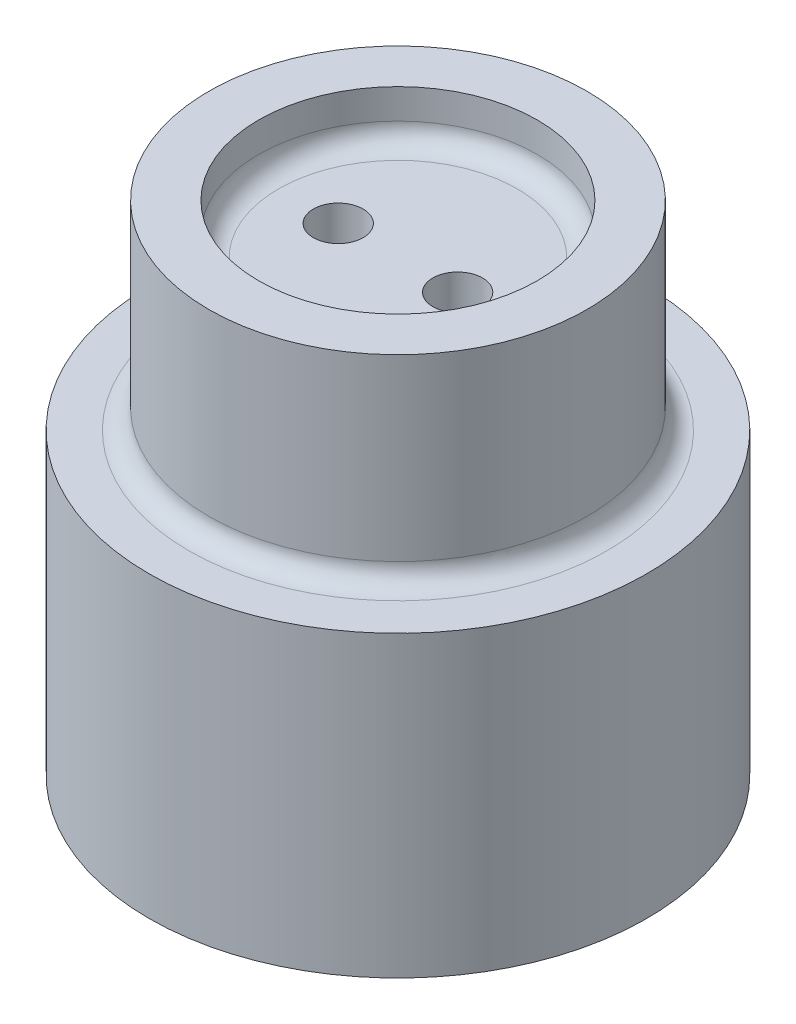
ISO-10303-21;
HEADER;
FILE_DESCRIPTION(('STEP AP214'),'2;1');
FILE_NAME('part.step','',(''),(''),'','','');
FILE_SCHEMA(('AUTOMOTIVE_DESIGN { 1 0 10303 214 1 1 1 1 }'));
ENDSEC;
DATA;
#1=APPLICATION_CONTEXT('core data for automotive mechanical design processes');
#2=APPLICATION_PROTOCOL_DEFINITION('international standard','automotive_design',2000,#1);
#3=PRODUCT_CONTEXT('',#1,'mechanical');
#4=PRODUCT('Part','Part','',(#3));
#5=PRODUCT_RELATED_PRODUCT_CATEGORY('part','',(#4));
#6=PRODUCT_DEFINITION_FORMATION('','',#4);
#7=PRODUCT_DEFINITION_CONTEXT('part definition',#1,'design');
#8=PRODUCT_DEFINITION('design','',#6,#7);
#9=PRODUCT_DEFINITION_SHAPE('','',#8);
#10=(LENGTH_UNIT() NAMED_UNIT(*) SI_UNIT(.MILLI.,.METRE.));
#11=(NAMED_UNIT(*) PLANE_ANGLE_UNIT() SI_UNIT($,.RADIAN.));
#12=(NAMED_UNIT(*) SI_UNIT($,.STERADIAN.) SOLID_ANGLE_UNIT());
#13=UNCERTAINTY_MEASURE_WITH_UNIT(LENGTH_MEASURE(1.E-05),#10,'distance_accuracy_value','');
#14=(GEOMETRIC_REPRESENTATION_CONTEXT(3) GLOBAL_UNCERTAINTY_ASSIGNED_CONTEXT((#13)) GLOBAL_UNIT_ASSIGNED_CONTEXT((#10,
#11,#12)) REPRESENTATION_CONTEXT('',''));
#15=CARTESIAN_POINT('',(0.,0.,0.));
#16=DIRECTION('',(0.,0.,1.));
#17=DIRECTION('',(1.,0.,0.));
#18=AXIS2_PLACEMENT_3D('',#15,#16,#17);
#19=CARTESIAN_POINT('',(-15.24,114.3,0.));
#20=DIRECTION('',(0.,-1.,0.));
#21=DIRECTION('',(1.,0.,0.));
#22=AXIS2_PLACEMENT_3D('',#19,#20,#21);
#23=CYLINDRICAL_SURFACE('',#22,6.35);
#24=CARTESIAN_POINT('',(-15.24,50.8,0.));
#25=DIRECTION('',(-0.707106781186548,-0.707106781186547,0.));
#26=DIRECTION('',(0.707106781186547,-0.707106781186548,0.));
#27=AXIS2_PLACEMENT_3D('',#24,#25,#26);
#28=ELLIPSE('',#27,8.98025612106915,6.35);
#29=CARTESIAN_POINT('',(-8.89000000000001,44.45,0.));
#30=VERTEX_POINT('',#29);
#31=EDGE_CURVE('E141',#30,#30,#28,.F.);
#32=ORIENTED_EDGE('',*,*,#31,.F.);
#33=EDGE_LOOP('',(#32));
#34=FACE_BOUND('',#33,.T.);
#35=CARTESIAN_POINT('',(-15.24,114.3,0.));
#36=DIRECTION('',(0.,-1.,0.));
#37=DIRECTION('',(0.,0.,1.));
#38=AXIS2_PLACEMENT_3D('',#35,#36,#37);
#39=CIRCLE('',#38,6.35);
#40=CARTESIAN_POINT('',(-15.24,114.3,6.35));
#41=VERTEX_POINT('',#40);
#42=EDGE_CURVE('E161',#41,#41,#39,.T.);
#43=ORIENTED_EDGE('',*,*,#42,.F.);
#44=EDGE_LOOP('',(#43));
#45=FACE_BOUND('',#44,.T.);
#46=ADVANCED_FACE('F44',(#34,#45),#23,.F.);
#47=CARTESIAN_POINT('',(-1.17,50.8,0.));
#48=DIRECTION('',(-1.,0.,0.));
#49=DIRECTION('',(0.,0.,1.));
#50=AXIS2_PLACEMENT_3D('',#47,#48,#49);
#51=CYLINDRICAL_SURFACE('',#50,6.35);
#52=ORIENTED_EDGE('',*,*,#31,.T.);
#53=EDGE_LOOP('',(#52));
#54=FACE_BOUND('',#53,.T.);
#55=CARTESIAN_POINT('',(-33.02,50.8,0.));
#56=DIRECTION('',(-0.707106781186548,-0.707106781186548,0.));
#57=DIRECTION('',(-0.707106781186548,0.707106781186548,0.));
#58=AXIS2_PLACEMENT_3D('',#55,#56,#57);
#59=ELLIPSE('',#58,8.98025612106915,6.35);
#60=CARTESIAN_POINT('',(-39.37,57.15,0.));
#61=VERTEX_POINT('',#60);
#62=EDGE_CURVE('E151',#61,#61,#59,.F.);
#63=ORIENTED_EDGE('',*,*,#62,.F.);
#64=EDGE_LOOP('',(#63));
#65=FACE_BOUND('',#64,.T.);
#66=ADVANCED_FACE('F170',(#54,#65),#51,.F.);
#67=CARTESIAN_POINT('',(-33.02,64.87,0.));
#68=DIRECTION('',(0.,-1.,0.));
#69=DIRECTION('',(0.,0.,-1.));
#70=AXIS2_PLACEMENT_3D('',#67,#68,#69);
#71=CYLINDRICAL_SURFACE('',#70,6.35);
#72=ORIENTED_EDGE('',*,*,#62,.T.);
#73=EDGE_LOOP('',(#72));
#74=FACE_BOUND('',#73,.T.);
#75=CARTESIAN_POINT('',(-33.02,0.,0.));
#76=DIRECTION('',(0.,1.,0.));
#77=DIRECTION('',(0.,0.,-1.));
#78=AXIS2_PLACEMENT_3D('',#75,#76,#77);
#79=CIRCLE('',#78,6.35);
#80=CARTESIAN_POINT('',(-33.02,0.,-6.35));
#81=VERTEX_POINT('',#80);
#82=EDGE_CURVE('E147',#81,#81,#79,.T.);
#83=ORIENTED_EDGE('',*,*,#82,.F.);
#84=EDGE_LOOP('',(#83));
#85=FACE_BOUND('',#84,.T.);
#86=ADVANCED_FACE('F177',(#74,#85),#71,.F.);
#87=CARTESIAN_POINT('',(0.,0.,0.));
#88=DIRECTION('',(0.,1.,0.));
#89=DIRECTION('',(0.,0.,1.));
#90=AXIS2_PLACEMENT_3D('',#87,#88,#89);
#91=PLANE('',#90);
#92=ORIENTED_EDGE('',*,*,#82,.T.);
#93=EDGE_LOOP('',(#92));
#94=FACE_BOUND('',#93,.T.);
#95=CARTESIAN_POINT('',(0.,0.,0.));
#96=DIRECTION('',(0.,1.,0.));
#97=DIRECTION('',(0.,0.,1.));
#98=AXIS2_PLACEMENT_3D('',#95,#96,#97);
#99=CIRCLE('',#98,63.5);
#100=CARTESIAN_POINT('',(0.,0.,63.5));
#101=VERTEX_POINT('',#100);
#102=EDGE_CURVE('E89',#101,#101,#99,.T.);
#103=ORIENTED_EDGE('',*,*,#102,.F.);
#104=EDGE_LOOP('',(#103));
#105=FACE_BOUND('',#104,.T.);
#106=CARTESIAN_POINT('',(33.02,0.,0.));
#107=DIRECTION('',(0.,-1.,0.));
#108=DIRECTION('',(0.,0.,-1.));
#109=AXIS2_PLACEMENT_3D('',#106,#107,#108);
#110=CIRCLE('',#109,6.35);
#111=CARTESIAN_POINT('',(33.02,0.,-6.35));
#112=VERTEX_POINT('',#111);
#113=EDGE_CURVE('E123',#112,#112,#110,.T.);
#114=ORIENTED_EDGE('',*,*,#113,.F.);
#115=EDGE_LOOP('',(#114));
#116=FACE_BOUND('',#115,.T.);
#117=ADVANCED_FACE('F184',(#94,#105,#116),#91,.F.);
#118=CARTESIAN_POINT('',(0.,12.7,0.));
#119=DIRECTION('',(0.,1.,0.));
#120=DIRECTION('',(0.,0.,1.));
#121=AXIS2_PLACEMENT_3D('',#118,#119,#120);
#122=CYLINDRICAL_SURFACE('',#121,63.5);
#123=CARTESIAN_POINT('',(0.,76.2,0.));
#124=DIRECTION('',(0.,1.,0.));
#125=DIRECTION('',(0.,0.,1.));
#126=AXIS2_PLACEMENT_3D('',#123,#124,#125);
#127=CIRCLE('',#126,63.5);
#128=CARTESIAN_POINT('',(0.,76.2,63.5));
#129=VERTEX_POINT('',#128);
#130=EDGE_CURVE('E93',#129,#129,#127,.T.);
#131=ORIENTED_EDGE('',*,*,#130,.F.);
#132=EDGE_LOOP('',(#131));
#133=FACE_BOUND('',#132,.T.);
#134=ORIENTED_EDGE('',*,*,#102,.T.);
#135=EDGE_LOOP('',(#134));
#136=FACE_BOUND('',#135,.T.);
#137=ADVANCED_FACE('F256',(#133,#136),#122,.T.);
#138=CARTESIAN_POINT('',(63.5,76.2,0.));
#139=DIRECTION('',(0.,-1.,0.));
#140=DIRECTION('',(0.,0.,-1.));
#141=AXIS2_PLACEMENT_3D('',#138,#139,#140);
#142=PLANE('',#141);
#143=CARTESIAN_POINT('',(0.,76.2,0.));
#144=DIRECTION('',(0.,-1.,0.));
#145=DIRECTION('',(0.,0.,-1.));
#146=AXIS2_PLACEMENT_3D('',#143,#144,#145);
#147=CIRCLE('',#146,53.34);
#148=CARTESIAN_POINT('',(0.,76.2,-53.34));
#149=VERTEX_POINT('',#148);
#150=EDGE_CURVE('E58',#149,#149,#147,.T.);
#151=ORIENTED_EDGE('',*,*,#150,.T.);
#152=EDGE_LOOP('',(#151));
#153=FACE_BOUND('',#152,.T.);
#154=ORIENTED_EDGE('',*,*,#130,.T.);
#155=EDGE_LOOP('',(#154));
#156=FACE_BOUND('',#155,.T.);
#157=ADVANCED_FACE('F252',(#153,#156),#142,.F.);
#158=CARTESIAN_POINT('',(0.,12.7,0.));
#159=DIRECTION('',(0.,1.,0.));
#160=DIRECTION('',(0.,0.,1.));
#161=AXIS2_PLACEMENT_3D('',#158,#159,#160);
#162=CYLINDRICAL_SURFACE('',#161,48.26);
#163=CARTESIAN_POINT('',(0.,81.28,0.));
#164=DIRECTION('',(0.,-1.,0.));
#165=DIRECTION('',(0.,0.,-1.));
#166=AXIS2_PLACEMENT_3D('',#163,#164,#165);
#167=CIRCLE('',#166,48.26);
#168=CARTESIAN_POINT('',(0.,81.28,-48.26));
#169=VERTEX_POINT('',#168);
#170=EDGE_CURVE('E63',#169,#169,#167,.F.);
#171=ORIENTED_EDGE('',*,*,#170,.T.);
#172=EDGE_LOOP('',(#171));
#173=FACE_BOUND('',#172,.T.);
#174=CARTESIAN_POINT('',(0.,127.,0.));
#175=DIRECTION('',(0.,1.,0.));
#176=DIRECTION('',(0.,0.,1.));
#177=AXIS2_PLACEMENT_3D('',#174,#175,#176);
#178=CIRCLE('',#177,48.26);
#179=CARTESIAN_POINT('',(0.,127.,48.26));
#180=VERTEX_POINT('',#179);
#181=EDGE_CURVE('E97',#180,#180,#178,.T.);
#182=ORIENTED_EDGE('',*,*,#181,.F.);
#183=EDGE_LOOP('',(#182));
#184=FACE_BOUND('',#183,.T.);
#185=ADVANCED_FACE('F248',(#173,#184),#162,.T.);
#186=CARTESIAN_POINT('',(35.56,127.,0.));
#187=DIRECTION('',(0.,-1.,0.));
#188=DIRECTION('',(0.,0.,-1.));
#189=AXIS2_PLACEMENT_3D('',#186,#187,#188);
#190=PLANE('',#189);
#191=CARTESIAN_POINT('',(0.,127.,0.));
#192=DIRECTION('',(0.,1.,0.));
#193=DIRECTION('',(0.,0.,1.));
#194=AXIS2_PLACEMENT_3D('',#191,#192,#193);
#195=CIRCLE('',#194,35.56);
#196=CARTESIAN_POINT('',(0.,127.,35.56));
#197=VERTEX_POINT('',#196);
#198=EDGE_CURVE('E101',#197,#197,#195,.T.);
#199=ORIENTED_EDGE('',*,*,#198,.F.);
#200=EDGE_LOOP('',(#199));
#201=FACE_BOUND('',#200,.T.);
#202=ORIENTED_EDGE('',*,*,#181,.T.);
#203=EDGE_LOOP('',(#202));
#204=FACE_BOUND('',#203,.T.);
#205=ADVANCED_FACE('F245',(#201,#204),#190,.F.);
#206=CARTESIAN_POINT('',(0.,12.7,0.));
#207=DIRECTION('',(0.,1.,0.));
#208=DIRECTION('',(0.,0.,1.));
#209=AXIS2_PLACEMENT_3D('',#206,#207,#208);
#210=CYLINDRICAL_SURFACE('',#209,35.56);
#211=CARTESIAN_POINT('',(0.,119.38,0.));
#212=DIRECTION('',(0.,1.,0.));
#213=DIRECTION('',(0.,0.,1.));
#214=AXIS2_PLACEMENT_3D('',#211,#212,#213);
#215=CIRCLE('',#214,35.56);
#216=CARTESIAN_POINT('',(0.,119.38,35.56));
#217=VERTEX_POINT('',#216);
#218=EDGE_CURVE('E10',#217,#217,#215,.F.);
#219=ORIENTED_EDGE('',*,*,#218,.T.);
#220=EDGE_LOOP('',(#219));
#221=FACE_BOUND('',#220,.T.);
#222=ORIENTED_EDGE('',*,*,#198,.T.);
#223=EDGE_LOOP('',(#222));
#224=FACE_BOUND('',#223,.T.);
#225=ADVANCED_FACE('F231',(#221,#224),#210,.F.);
#226=CARTESIAN_POINT('',(0.,114.3,0.));
#227=DIRECTION('',(0.,1.,0.));
#228=DIRECTION('',(0.,0.,1.));
#229=AXIS2_PLACEMENT_3D('',#226,#227,#228);
#230=PLANE('',#229);
#231=CARTESIAN_POINT('',(0.,114.3,0.));
#232=DIRECTION('',(0.,1.,0.));
#233=DIRECTION('',(0.,0.,1.));
#234=AXIS2_PLACEMENT_3D('',#231,#232,#233);
#235=CIRCLE('',#234,30.48);
#236=CARTESIAN_POINT('',(0.,114.3,30.48));
#237=VERTEX_POINT('',#236);
#238=EDGE_CURVE('E53',#237,#237,#235,.T.);
#239=ORIENTED_EDGE('',*,*,#238,.T.);
#240=EDGE_LOOP('',(#239));
#241=FACE_BOUND('',#240,.T.);
#242=ORIENTED_EDGE('',*,*,#42,.T.);
#243=EDGE_LOOP('',(#242));
#244=FACE_BOUND('',#243,.T.);
#245=CARTESIAN_POINT('',(15.24,114.3,0.));
#246=DIRECTION('',(0.,1.,0.));
#247=DIRECTION('',(0.,0.,1.));
#248=AXIS2_PLACEMENT_3D('',#245,#246,#247);
#249=CIRCLE('',#248,6.35);
#250=CARTESIAN_POINT('',(15.24,114.3,6.35));
#251=VERTEX_POINT('',#250);
#252=EDGE_CURVE('E137',#251,#251,#249,.T.);
#253=ORIENTED_EDGE('',*,*,#252,.F.);
#254=EDGE_LOOP('',(#253));
#255=FACE_BOUND('',#254,.T.);
#256=ADVANCED_FACE('F166',(#241,#244,#255),#230,.T.);
#257=CARTESIAN_POINT('',(15.24,114.3,0.));
#258=DIRECTION('',(0.,-1.,0.));
#259=DIRECTION('',(1.,0.,0.));
#260=AXIS2_PLACEMENT_3D('',#257,#258,#259);
#261=CYLINDRICAL_SURFACE('',#260,6.35);
#262=CARTESIAN_POINT('',(15.24,50.8,0.));
#263=DIRECTION('',(0.707106781186548,-0.707106781186547,0.));
#264=DIRECTION('',(-0.707106781186547,-0.707106781186548,0.));
#265=AXIS2_PLACEMENT_3D('',#262,#263,#264);
#266=ELLIPSE('',#265,8.98025612106915,6.35);
#267=CARTESIAN_POINT('',(8.89000000000001,44.45,0.));
#268=VERTEX_POINT('',#267);
#269=EDGE_CURVE('E117',#268,#268,#266,.F.);
#270=ORIENTED_EDGE('',*,*,#269,.F.);
#271=EDGE_LOOP('',(#270));
#272=FACE_BOUND('',#271,.T.);
#273=ORIENTED_EDGE('',*,*,#252,.T.);
#274=EDGE_LOOP('',(#273));
#275=FACE_BOUND('',#274,.T.);
#276=ADVANCED_FACE('F200',(#272,#275),#261,.F.);
#277=CARTESIAN_POINT('',(1.17,50.8,0.));
#278=DIRECTION('',(1.,0.,0.));
#279=DIRECTION('',(0.,0.,-1.));
#280=AXIS2_PLACEMENT_3D('',#277,#278,#279);
#281=CYLINDRICAL_SURFACE('',#280,6.35);
#282=ORIENTED_EDGE('',*,*,#269,.T.);
#283=EDGE_LOOP('',(#282));
#284=FACE_BOUND('',#283,.T.);
#285=CARTESIAN_POINT('',(33.02,50.8,0.));
#286=DIRECTION('',(0.707106781186548,-0.707106781186548,0.));
#287=DIRECTION('',(0.707106781186548,0.707106781186548,0.));
#288=AXIS2_PLACEMENT_3D('',#285,#286,#287);
#289=ELLIPSE('',#288,8.98025612106915,6.35);
#290=CARTESIAN_POINT('',(39.37,57.15,0.));
#291=VERTEX_POINT('',#290);
#292=EDGE_CURVE('E127',#291,#291,#289,.F.);
#293=ORIENTED_EDGE('',*,*,#292,.F.);
#294=EDGE_LOOP('',(#293));
#295=FACE_BOUND('',#294,.T.);
#296=ADVANCED_FACE('F202',(#284,#295),#281,.F.);
#297=CARTESIAN_POINT('',(33.02,64.87,0.));
#298=DIRECTION('',(0.,-1.,0.));
#299=DIRECTION('',(0.,0.,-1.));
#300=AXIS2_PLACEMENT_3D('',#297,#298,#299);
#301=CYLINDRICAL_SURFACE('',#300,6.35);
#302=ORIENTED_EDGE('',*,*,#292,.T.);
#303=EDGE_LOOP('',(#302));
#304=FACE_BOUND('',#303,.T.);
#305=ORIENTED_EDGE('',*,*,#113,.T.);
#306=EDGE_LOOP('',(#305));
#307=FACE_BOUND('',#306,.T.);
#308=ADVANCED_FACE('F206',(#304,#307),#301,.F.);
#309=CARTESIAN_POINT('',(0.,81.28,0.));
#310=DIRECTION('',(0.,-1.,0.));
#311=DIRECTION('',(0.,0.,-1.));
#312=AXIS2_PLACEMENT_3D('',#309,#310,#311);
#313=TOROIDAL_SURFACE('',#312,53.34,5.08);
#314=ORIENTED_EDGE('',*,*,#150,.F.);
#315=EDGE_LOOP('',(#314));
#316=FACE_BOUND('',#315,.T.);
#317=ORIENTED_EDGE('',*,*,#170,.F.);
#318=EDGE_LOOP('',(#317));
#319=FACE_BOUND('',#318,.T.);
#320=ADVANCED_FACE('F210',(#316,#319),#313,.F.);
#321=CARTESIAN_POINT('',(0.,119.38,0.));
#322=DIRECTION('',(0.,1.,0.));
#323=DIRECTION('',(0.,0.,1.));
#324=AXIS2_PLACEMENT_3D('',#321,#322,#323);
#325=TOROIDAL_SURFACE('',#324,30.48,5.08);
#326=ORIENTED_EDGE('',*,*,#218,.F.);
#327=EDGE_LOOP('',(#326));
#328=FACE_BOUND('',#327,.T.);
#329=ORIENTED_EDGE('',*,*,#238,.F.);
#330=EDGE_LOOP('',(#329));
#331=FACE_BOUND('',#330,.T.);
#332=ADVANCED_FACE('F46',(#328,#331),#325,.F.);
#333=CLOSED_SHELL('',(#46,#66,#86,#117,#137,#157,#185,#205,#225,#256,#276,#296,#308,#320,#332));
#334=CARTESIAN_POINT('',(0.,106.68,0.));
#335=DIRECTION('',(0.,1.,0.));
#336=DIRECTION('',(0.,0.,1.));
#337=AXIS2_PLACEMENT_3D('',#334,#335,#336);
#338=PLANE('',#337);
#339=CARTESIAN_POINT('',(15.24,106.68,0.));
#340=DIRECTION('',(0.,1.,0.));
#341=DIRECTION('',(0.,0.,1.));
#342=AXIS2_PLACEMENT_3D('',#339,#340,#341);
#343=CIRCLE('',#342,8.89);
#344=CARTESIAN_POINT('',(15.24,106.68,8.89));
#345=VERTEX_POINT('',#344);
#346=EDGE_CURVE('E77',#345,#345,#343,.F.);
#347=ORIENTED_EDGE('',*,*,#346,.F.);
#348=EDGE_LOOP('',(#347));
#349=FACE_BOUND('',#348,.T.);
#350=CARTESIAN_POINT('',(0.,106.68,0.));
#351=DIRECTION('',(0.,1.,0.));
#352=DIRECTION('',(0.,0.,1.));
#353=AXIS2_PLACEMENT_3D('',#350,#351,#352);
#354=CIRCLE('',#353,35.56);
#355=CARTESIAN_POINT('',(0.,106.68,35.56));
#356=VERTEX_POINT('',#355);
#357=EDGE_CURVE('E85',#356,#356,#354,.F.);
#358=ORIENTED_EDGE('',*,*,#357,.T.);
#359=EDGE_LOOP('',(#358));
#360=FACE_BOUND('',#359,.T.);
#361=CARTESIAN_POINT('',(-15.24,106.68,0.));
#362=DIRECTION('',(0.,1.,0.));
#363=DIRECTION('',(0.,0.,1.));
#364=AXIS2_PLACEMENT_3D('',#361,#362,#363);
#365=CIRCLE('',#364,8.89);
#366=CARTESIAN_POINT('',(-15.24,106.68,8.89));
#367=VERTEX_POINT('',#366);
#368=EDGE_CURVE('E69',#367,#367,#365,.F.);
#369=ORIENTED_EDGE('',*,*,#368,.F.);
#370=EDGE_LOOP('',(#369));
#371=FACE_BOUND('',#370,.T.);
#372=ADVANCED_FACE('F224',(#349,#360,#371),#338,.F.);
#373=CARTESIAN_POINT('',(0.,12.7,0.));
#374=DIRECTION('',(0.,-1.,0.));
#375=DIRECTION('',(0.,0.,-1.));
#376=AXIS2_PLACEMENT_3D('',#373,#374,#375);
#377=PLANE('',#376);
#378=CARTESIAN_POINT('',(33.02,12.7,0.));
#379=DIRECTION('',(0.,-1.,0.));
#380=DIRECTION('',(0.,0.,-1.));
#381=AXIS2_PLACEMENT_3D('',#378,#379,#380);
#382=CIRCLE('',#381,8.89);
#383=CARTESIAN_POINT('',(33.02,12.7,-8.89));
#384=VERTEX_POINT('',#383);
#385=EDGE_CURVE('E81',#384,#384,#382,.F.);
#386=ORIENTED_EDGE('',*,*,#385,.F.);
#387=EDGE_LOOP('',(#386));
#388=FACE_BOUND('',#387,.T.);
#389=CARTESIAN_POINT('',(0.,12.7,0.));
#390=DIRECTION('',(0.,1.,0.));
#391=DIRECTION('',(0.,0.,1.));
#392=AXIS2_PLACEMENT_3D('',#389,#390,#391);
#393=CIRCLE('',#392,50.8);
#394=CARTESIAN_POINT('',(0.,12.7,50.8));
#395=VERTEX_POINT('',#394);
#396=EDGE_CURVE('E113',#395,#395,#393,.T.);
#397=ORIENTED_EDGE('',*,*,#396,.T.);
#398=EDGE_LOOP('',(#397));
#399=FACE_BOUND('',#398,.T.);
#400=CARTESIAN_POINT('',(-33.02,12.7,0.));
#401=DIRECTION('',(0.,-1.,0.));
#402=DIRECTION('',(0.,0.,-1.));
#403=AXIS2_PLACEMENT_3D('',#400,#401,#402);
#404=CIRCLE('',#403,8.89);
#405=CARTESIAN_POINT('',(-33.02,12.7,-8.89));
#406=VERTEX_POINT('',#405);
#407=EDGE_CURVE('E73',#406,#406,#404,.F.);
#408=ORIENTED_EDGE('',*,*,#407,.F.);
#409=EDGE_LOOP('',(#408));
#410=FACE_BOUND('',#409,.T.);
#411=ADVANCED_FACE('F227',(#388,#399,#410),#377,.F.);
#412=CARTESIAN_POINT('',(0.,12.7,0.));
#413=DIRECTION('',(0.,1.,0.));
#414=DIRECTION('',(0.,0.,1.));
#415=AXIS2_PLACEMENT_3D('',#412,#413,#414);
#416=CYLINDRICAL_SURFACE('',#415,50.8);
#417=ORIENTED_EDGE('',*,*,#396,.F.);
#418=EDGE_LOOP('',(#417));
#419=FACE_BOUND('',#418,.T.);
#420=CARTESIAN_POINT('',(0.,63.5,0.));
#421=DIRECTION('',(0.,1.,0.));
#422=DIRECTION('',(0.,0.,1.));
#423=AXIS2_PLACEMENT_3D('',#420,#421,#422);
#424=CIRCLE('',#423,50.8);
#425=CARTESIAN_POINT('',(0.,63.5,50.8));
#426=VERTEX_POINT('',#425);
#427=EDGE_CURVE('E109',#426,#426,#424,.T.);
#428=ORIENTED_EDGE('',*,*,#427,.T.);
#429=EDGE_LOOP('',(#428));
#430=FACE_BOUND('',#429,.T.);
#431=ADVANCED_FACE('F234',(#419,#430),#416,.F.);
#432=CARTESIAN_POINT('',(50.8,63.5,0.));
#433=DIRECTION('',(0.,1.,0.));
#434=DIRECTION('',(0.,0.,1.));
#435=AXIS2_PLACEMENT_3D('',#432,#433,#434);
#436=PLANE('',#435);
#437=ORIENTED_EDGE('',*,*,#427,.F.);
#438=EDGE_LOOP('',(#437));
#439=FACE_BOUND('',#438,.T.);
#440=CARTESIAN_POINT('',(0.,63.5,0.));
#441=DIRECTION('',(0.,1.,0.));
#442=DIRECTION('',(0.,0.,1.));
#443=AXIS2_PLACEMENT_3D('',#440,#441,#442);
#444=CIRCLE('',#443,35.56);
#445=CARTESIAN_POINT('',(0.,63.5,35.56));
#446=VERTEX_POINT('',#445);
#447=EDGE_CURVE('E105',#446,#446,#444,.T.);
#448=ORIENTED_EDGE('',*,*,#447,.T.);
#449=EDGE_LOOP('',(#448));
#450=FACE_BOUND('',#449,.T.);
#451=ADVANCED_FACE('F238',(#439,#450),#436,.F.);
#452=ORIENTED_EDGE('',*,*,#447,.F.);
#453=EDGE_LOOP('',(#452));
#454=FACE_BOUND('',#453,.T.);
#455=ORIENTED_EDGE('',*,*,#357,.F.);
#456=EDGE_LOOP('',(#455));
#457=FACE_BOUND('',#456,.T.);
#458=ADVANCED_FACE('F216',(#454,#457),#210,.F.);
#459=CARTESIAN_POINT('',(15.24,114.3,0.));
#460=DIRECTION('',(0.,-1.,0.));
#461=DIRECTION('',(1.,0.,0.));
#462=AXIS2_PLACEMENT_3D('',#459,#460,#461);
#463=CYLINDRICAL_SURFACE('',#462,8.89);
#464=CARTESIAN_POINT('',(15.24,50.8,0.));
#465=DIRECTION('',(0.707106781186548,-0.707106781186547,0.));
#466=DIRECTION('',(-0.707106781186547,-0.707106781186548,0.));
#467=AXIS2_PLACEMENT_3D('',#464,#465,#466);
#468=ELLIPSE('',#467,12.5723585694968,8.89);
#469=CARTESIAN_POINT('',(6.35000000000001,41.91,0.));
#470=VERTEX_POINT('',#469);
#471=EDGE_CURVE('E122',#470,#470,#468,.T.);
#472=ORIENTED_EDGE('',*,*,#471,.F.);
#473=EDGE_LOOP('',(#472));
#474=FACE_BOUND('',#473,.T.);
#475=ORIENTED_EDGE('',*,*,#346,.T.);
#476=EDGE_LOOP('',(#475));
#477=FACE_BOUND('',#476,.T.);
#478=ADVANCED_FACE('F212',(#474,#477),#463,.T.);
#479=CARTESIAN_POINT('',(33.02,70.458,0.));
#480=DIRECTION('',(0.,-1.,0.));
#481=DIRECTION('',(0.,0.,-1.));
#482=AXIS2_PLACEMENT_3D('',#479,#480,#481);
#483=CYLINDRICAL_SURFACE('',#482,8.89);
#484=CARTESIAN_POINT('',(33.02,50.8,0.));
#485=DIRECTION('',(0.707106781186547,-0.707106781186547,0.));
#486=DIRECTION('',(0.707106781186548,0.707106781186548,0.));
#487=AXIS2_PLACEMENT_3D('',#484,#485,#486);
#488=ELLIPSE('',#487,12.5723585694968,8.89);
#489=CARTESIAN_POINT('',(41.91,59.69,0.));
#490=VERTEX_POINT('',#489);
#491=EDGE_CURVE('E118',#490,#490,#488,.T.);
#492=ORIENTED_EDGE('',*,*,#491,.T.);
#493=EDGE_LOOP('',(#492));
#494=FACE_BOUND('',#493,.T.);
#495=ORIENTED_EDGE('',*,*,#385,.T.);
#496=EDGE_LOOP('',(#495));
#497=FACE_BOUND('',#496,.T.);
#498=ADVANCED_FACE('F215',(#494,#497),#483,.T.);
#499=CARTESIAN_POINT('',(-4.41799999999999,50.8,0.));
#500=DIRECTION('',(1.,0.,0.));
#501=DIRECTION('',(0.,0.,-1.));
#502=AXIS2_PLACEMENT_3D('',#499,#500,#501);
#503=CYLINDRICAL_SURFACE('',#502,8.89);
#504=ORIENTED_EDGE('',*,*,#471,.T.);
#505=EDGE_LOOP('',(#504));
#506=FACE_BOUND('',#505,.T.);
#507=ORIENTED_EDGE('',*,*,#491,.F.);
#508=EDGE_LOOP('',(#507));
#509=FACE_BOUND('',#508,.T.);
#510=ADVANCED_FACE('F190',(#506,#509),#503,.T.);
#511=CARTESIAN_POINT('',(-15.24,114.3,0.));
#512=DIRECTION('',(0.,-1.,0.));
#513=DIRECTION('',(1.,0.,0.));
#514=AXIS2_PLACEMENT_3D('',#511,#512,#513);
#515=CYLINDRICAL_SURFACE('',#514,8.89);
#516=CARTESIAN_POINT('',(-15.24,50.8,0.));
#517=DIRECTION('',(-0.707106781186548,-0.707106781186547,0.));
#518=DIRECTION('',(0.707106781186547,-0.707106781186548,0.));
#519=AXIS2_PLACEMENT_3D('',#516,#517,#518);
#520=ELLIPSE('',#519,12.5723585694968,8.89);
#521=CARTESIAN_POINT('',(-6.35000000000001,41.91,0.));
#522=VERTEX_POINT('',#521);
#523=EDGE_CURVE('E146',#522,#522,#520,.T.);
#524=ORIENTED_EDGE('',*,*,#523,.F.);
#525=EDGE_LOOP('',(#524));
#526=FACE_BOUND('',#525,.T.);
#527=ORIENTED_EDGE('',*,*,#368,.T.);
#528=EDGE_LOOP('',(#527));
#529=FACE_BOUND('',#528,.T.);
#530=ADVANCED_FACE('F186',(#526,#529),#515,.T.);
#531=CARTESIAN_POINT('',(-33.02,70.458,0.));
#532=DIRECTION('',(0.,-1.,0.));
#533=DIRECTION('',(0.,0.,-1.));
#534=AXIS2_PLACEMENT_3D('',#531,#532,#533);
#535=CYLINDRICAL_SURFACE('',#534,8.89);
#536=CARTESIAN_POINT('',(-33.02,50.8,0.));
#537=DIRECTION('',(-0.707106781186547,-0.707106781186547,0.));
#538=DIRECTION('',(-0.707106781186548,0.707106781186548,0.));
#539=AXIS2_PLACEMENT_3D('',#536,#537,#538);
#540=ELLIPSE('',#539,12.5723585694968,8.89);
#541=CARTESIAN_POINT('',(-41.91,59.69,0.));
#542=VERTEX_POINT('',#541);
#543=EDGE_CURVE('E142',#542,#542,#540,.T.);
#544=ORIENTED_EDGE('',*,*,#543,.T.);
#545=EDGE_LOOP('',(#544));
#546=FACE_BOUND('',#545,.T.);
#547=ORIENTED_EDGE('',*,*,#407,.T.);
#548=EDGE_LOOP('',(#547));
#549=FACE_BOUND('',#548,.T.);
#550=ADVANCED_FACE('F189',(#546,#549),#535,.T.);
#551=CARTESIAN_POINT('',(4.41799999999999,50.8,0.));
#552=DIRECTION('',(-1.,0.,0.));
#553=DIRECTION('',(0.,0.,1.));
#554=AXIS2_PLACEMENT_3D('',#551,#552,#553);
#555=CYLINDRICAL_SURFACE('',#554,8.89);
#556=ORIENTED_EDGE('',*,*,#523,.T.);
#557=EDGE_LOOP('',(#556));
#558=FACE_BOUND('',#557,.T.);
#559=ORIENTED_EDGE('',*,*,#543,.F.);
#560=EDGE_LOOP('',(#559));
#561=FACE_BOUND('',#560,.T.);
#562=ADVANCED_FACE('F193',(#558,#561),#555,.T.);
#563=CLOSED_SHELL('',(#372,#411,#431,#451,#458,#478,#498,#510,#530,#550,#562));
#564=ORIENTED_CLOSED_SHELL('',*,#563,.T.);
#565=BREP_WITH_VOIDS('B2',#333,(#564));
#566=ADVANCED_BREP_SHAPE_REPRESENTATION('',(#18,#565),#14);
#567=SHAPE_DEFINITION_REPRESENTATION(#9,#566);
ENDSEC;
END-ISO-10303-21;
